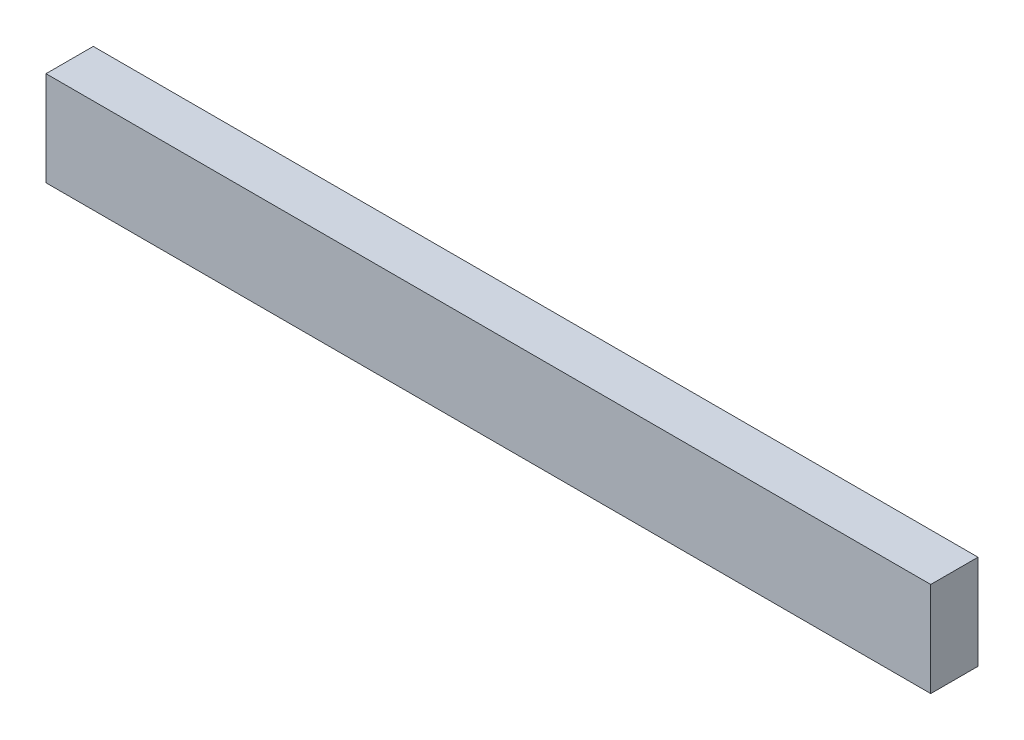
ISO-10303-21;
HEADER;
FILE_DESCRIPTION(('STEP AP214'),'2;1');
FILE_NAME('part.step','',(''),(''),'','','');
FILE_SCHEMA(('AUTOMOTIVE_DESIGN { 1 0 10303 214 1 1 1 1 }'));
ENDSEC;
DATA;
#1=APPLICATION_CONTEXT('core data for automotive mechanical design processes');
#2=APPLICATION_PROTOCOL_DEFINITION('international standard','automotive_design',2000,#1);
#3=PRODUCT_CONTEXT('',#1,'mechanical');
#4=PRODUCT('Part','Part','',(#3));
#5=PRODUCT_RELATED_PRODUCT_CATEGORY('part','',(#4));
#6=PRODUCT_DEFINITION_FORMATION('','',#4);
#7=PRODUCT_DEFINITION_CONTEXT('part definition',#1,'design');
#8=PRODUCT_DEFINITION('design','',#6,#7);
#9=PRODUCT_DEFINITION_SHAPE('','',#8);
#10=(LENGTH_UNIT() NAMED_UNIT(*) SI_UNIT(.MILLI.,.METRE.));
#11=(NAMED_UNIT(*) PLANE_ANGLE_UNIT() SI_UNIT($,.RADIAN.));
#12=(NAMED_UNIT(*) SI_UNIT($,.STERADIAN.) SOLID_ANGLE_UNIT());
#13=UNCERTAINTY_MEASURE_WITH_UNIT(LENGTH_MEASURE(1.E-05),#10,'distance_accuracy_value','');
#14=(GEOMETRIC_REPRESENTATION_CONTEXT(3) GLOBAL_UNCERTAINTY_ASSIGNED_CONTEXT((#13)) GLOBAL_UNIT_ASSIGNED_CONTEXT((#10,
#11,#12)) REPRESENTATION_CONTEXT('',''));
#15=CARTESIAN_POINT('',(0.,0.,0.));
#16=DIRECTION('',(0.,0.,1.));
#17=DIRECTION('',(1.,0.,0.));
#18=AXIS2_PLACEMENT_3D('',#15,#16,#17);
#19=CARTESIAN_POINT('',(0.,0.,25.));
#20=DIRECTION('',(1.,0.,0.));
#21=DIRECTION('',(0.,0.,-1.));
#22=AXIS2_PLACEMENT_3D('',#19,#20,#21);
#23=PLANE('',#22);
#24=DIRECTION('',(0.,-1.,0.));
#25=VECTOR('',#24,1.);
#26=CARTESIAN_POINT('',(0.,0.,0.));
#27=LINE('',#26,#25);
#28=CARTESIAN_POINT('',(0.,50.,0.));
#29=VERTEX_POINT('',#28);
#30=CARTESIAN_POINT('',(0.,0.,0.));
#31=VERTEX_POINT('',#30);
#32=EDGE_CURVE('E96',#29,#31,#27,.T.);
#33=ORIENTED_EDGE('',*,*,#32,.T.);
#34=DIRECTION('',(0.,0.,-1.));
#35=VECTOR('',#34,1.);
#36=CARTESIAN_POINT('',(0.,0.,25.));
#37=LINE('',#36,#35);
#38=CARTESIAN_POINT('',(0.,0.,25.));
#39=VERTEX_POINT('',#38);
#40=EDGE_CURVE('E11',#39,#31,#37,.T.);
#41=ORIENTED_EDGE('',*,*,#40,.F.);
#42=DIRECTION('',(0.,-1.,0.));
#43=VECTOR('',#42,1.);
#44=CARTESIAN_POINT('',(0.,0.,25.));
#45=LINE('',#44,#43);
#46=CARTESIAN_POINT('',(0.,50.,25.));
#47=VERTEX_POINT('',#46);
#48=EDGE_CURVE('E84',#47,#39,#45,.T.);
#49=ORIENTED_EDGE('',*,*,#48,.F.);
#50=DIRECTION('',(0.,0.,-1.));
#51=VECTOR('',#50,1.);
#52=CARTESIAN_POINT('',(0.,50.,25.));
#53=LINE('',#52,#51);
#54=EDGE_CURVE('E92',#47,#29,#53,.T.);
#55=ORIENTED_EDGE('',*,*,#54,.T.);
#56=EDGE_LOOP('',(#33,#41,#49,#55));
#57=FACE_BOUND('',#56,.T.);
#58=ADVANCED_FACE('F33',(#57),#23,.F.);
#59=CARTESIAN_POINT('',(0.,0.,25.));
#60=DIRECTION('',(0.,1.,0.));
#61=DIRECTION('',(0.,0.,1.));
#62=AXIS2_PLACEMENT_3D('',#59,#60,#61);
#63=PLANE('',#62);
#64=DIRECTION('',(1.,0.,0.));
#65=VECTOR('',#64,1.);
#66=CARTESIAN_POINT('',(0.,0.,0.));
#67=LINE('',#66,#65);
#68=CARTESIAN_POINT('',(468.,0.,0.));
#69=VERTEX_POINT('',#68);
#70=EDGE_CURVE('E88',#31,#69,#67,.T.);
#71=ORIENTED_EDGE('',*,*,#70,.T.);
#72=DIRECTION('',(0.,0.,-1.));
#73=VECTOR('',#72,1.);
#74=CARTESIAN_POINT('',(468.,0.,25.));
#75=LINE('',#74,#73);
#76=CARTESIAN_POINT('',(468.,0.,25.));
#77=VERTEX_POINT('',#76);
#78=EDGE_CURVE('E41',#77,#69,#75,.T.);
#79=ORIENTED_EDGE('',*,*,#78,.F.);
#80=DIRECTION('',(1.,0.,0.));
#81=VECTOR('',#80,1.);
#82=CARTESIAN_POINT('',(0.,0.,25.));
#83=LINE('',#82,#81);
#84=EDGE_CURVE('E79',#39,#77,#83,.T.);
#85=ORIENTED_EDGE('',*,*,#84,.F.);
#86=ORIENTED_EDGE('',*,*,#40,.T.);
#87=EDGE_LOOP('',(#71,#79,#85,#86));
#88=FACE_BOUND('',#87,.T.);
#89=ADVANCED_FACE('F87',(#88),#63,.F.);
#90=CARTESIAN_POINT('',(468.,0.,25.));
#91=DIRECTION('',(-1.,0.,0.));
#92=DIRECTION('',(0.,0.,1.));
#93=AXIS2_PLACEMENT_3D('',#90,#91,#92);
#94=PLANE('',#93);
#95=DIRECTION('',(0.,1.,0.));
#96=VECTOR('',#95,1.);
#97=CARTESIAN_POINT('',(468.,0.,0.));
#98=LINE('',#97,#96);
#99=CARTESIAN_POINT('',(468.,50.,0.));
#100=VERTEX_POINT('',#99);
#101=EDGE_CURVE('E66',#69,#100,#98,.T.);
#102=ORIENTED_EDGE('',*,*,#101,.T.);
#103=DIRECTION('',(0.,0.,-1.));
#104=VECTOR('',#103,1.);
#105=CARTESIAN_POINT('',(468.,50.,25.));
#106=LINE('',#105,#104);
#107=CARTESIAN_POINT('',(468.,50.,25.));
#108=VERTEX_POINT('',#107);
#109=EDGE_CURVE('E89',#108,#100,#106,.T.);
#110=ORIENTED_EDGE('',*,*,#109,.F.);
#111=DIRECTION('',(0.,1.,0.));
#112=VECTOR('',#111,1.);
#113=CARTESIAN_POINT('',(468.,0.,25.));
#114=LINE('',#113,#112);
#115=EDGE_CURVE('E82',#77,#108,#114,.T.);
#116=ORIENTED_EDGE('',*,*,#115,.F.);
#117=ORIENTED_EDGE('',*,*,#78,.T.);
#118=EDGE_LOOP('',(#102,#110,#116,#117));
#119=FACE_BOUND('',#118,.T.);
#120=ADVANCED_FACE('F90',(#119),#94,.F.);
#121=CARTESIAN_POINT('',(0.,50.,25.));
#122=DIRECTION('',(0.,-1.,0.));
#123=DIRECTION('',(0.,0.,-1.));
#124=AXIS2_PLACEMENT_3D('',#121,#122,#123);
#125=PLANE('',#124);
#126=DIRECTION('',(-1.,0.,0.));
#127=VECTOR('',#126,1.);
#128=CARTESIAN_POINT('',(0.,50.,0.));
#129=LINE('',#128,#127);
#130=EDGE_CURVE('E72',#100,#29,#129,.T.);
#131=ORIENTED_EDGE('',*,*,#130,.T.);
#132=ORIENTED_EDGE('',*,*,#54,.F.);
#133=DIRECTION('',(-1.,0.,0.));
#134=VECTOR('',#133,1.);
#135=CARTESIAN_POINT('',(0.,50.,25.));
#136=LINE('',#135,#134);
#137=EDGE_CURVE('E49',#108,#47,#136,.T.);
#138=ORIENTED_EDGE('',*,*,#137,.F.);
#139=ORIENTED_EDGE('',*,*,#109,.T.);
#140=EDGE_LOOP('',(#131,#132,#138,#139));
#141=FACE_BOUND('',#140,.T.);
#142=ADVANCED_FACE('F103',(#141),#125,.F.);
#143=CARTESIAN_POINT('',(0.,0.,25.));
#144=DIRECTION('',(0.,0.,-1.));
#145=DIRECTION('',(-1.,0.,0.));
#146=AXIS2_PLACEMENT_3D('',#143,#144,#145);
#147=PLANE('',#146);
#148=ORIENTED_EDGE('',*,*,#48,.T.);
#149=ORIENTED_EDGE('',*,*,#84,.T.);
#150=ORIENTED_EDGE('',*,*,#115,.T.);
#151=ORIENTED_EDGE('',*,*,#137,.T.);
#152=EDGE_LOOP('',(#148,#149,#150,#151));
#153=FACE_BOUND('',#152,.T.);
#154=ADVANCED_FACE('F80',(#153),#147,.F.);
#155=CARTESIAN_POINT('',(0.,0.,0.));
#156=DIRECTION('',(0.,0.,-1.));
#157=DIRECTION('',(-1.,0.,0.));
#158=AXIS2_PLACEMENT_3D('',#155,#156,#157);
#159=PLANE('',#158);
#160=ORIENTED_EDGE('',*,*,#32,.F.);
#161=ORIENTED_EDGE('',*,*,#130,.F.);
#162=ORIENTED_EDGE('',*,*,#101,.F.);
#163=ORIENTED_EDGE('',*,*,#70,.F.);
#164=EDGE_LOOP('',(#160,#161,#162,#163));
#165=FACE_BOUND('',#164,.T.);
#166=ADVANCED_FACE('F106',(#165),#159,.T.);
#167=CLOSED_SHELL('',(#58,#89,#120,#142,#154,#166));
#168=MANIFOLD_SOLID_BREP('B2',#167);
#169=ADVANCED_BREP_SHAPE_REPRESENTATION('',(#18,#168),#14);
#170=SHAPE_DEFINITION_REPRESENTATION(#9,#169);
ENDSEC;
END-ISO-10303-21;
